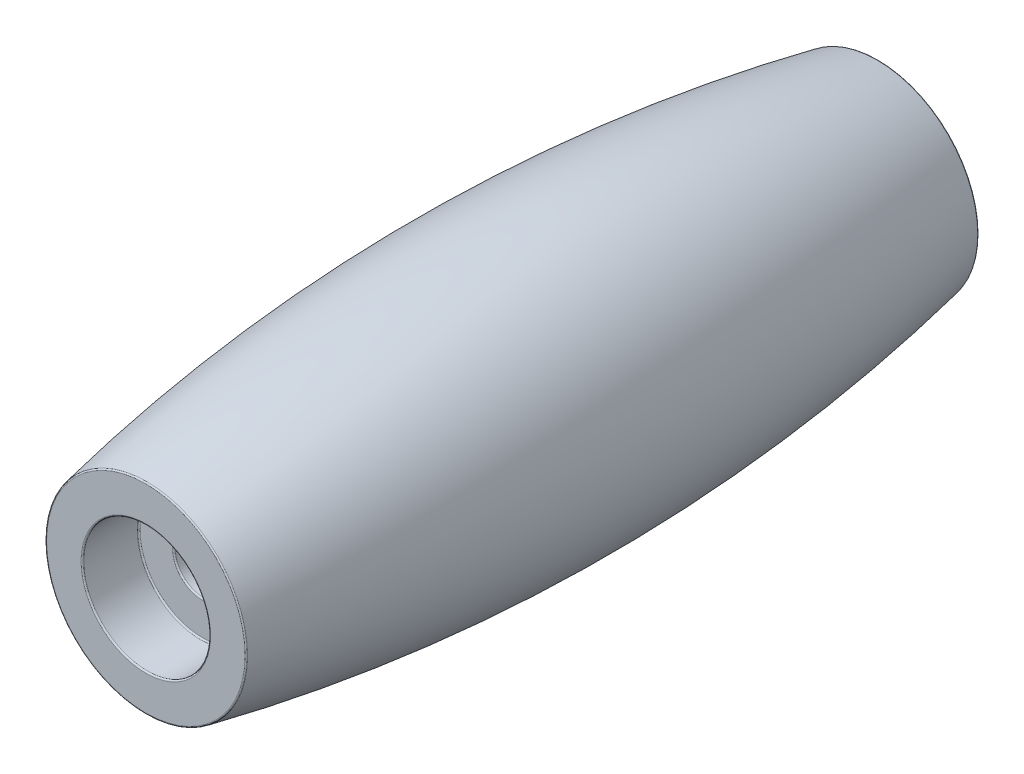
ISO-10303-21;
HEADER;
FILE_DESCRIPTION(('STEP AP214'),'2;1');
FILE_NAME('part.step','',(''),(''),'','','');
FILE_SCHEMA(('AUTOMOTIVE_DESIGN { 1 0 10303 214 1 1 1 1 }'));
ENDSEC;
DATA;
#1=APPLICATION_CONTEXT('core data for automotive mechanical design processes');
#2=APPLICATION_PROTOCOL_DEFINITION('international standard','automotive_design',2000,#1);
#3=PRODUCT_CONTEXT('',#1,'mechanical');
#4=PRODUCT('Part','Part','',(#3));
#5=PRODUCT_RELATED_PRODUCT_CATEGORY('part','',(#4));
#6=PRODUCT_DEFINITION_FORMATION('','',#4);
#7=PRODUCT_DEFINITION_CONTEXT('part definition',#1,'design');
#8=PRODUCT_DEFINITION('design','',#6,#7);
#9=PRODUCT_DEFINITION_SHAPE('','',#8);
#10=(LENGTH_UNIT() NAMED_UNIT(*) SI_UNIT(.MILLI.,.METRE.));
#11=(NAMED_UNIT(*) PLANE_ANGLE_UNIT() SI_UNIT($,.RADIAN.));
#12=(NAMED_UNIT(*) SI_UNIT($,.STERADIAN.) SOLID_ANGLE_UNIT());
#13=UNCERTAINTY_MEASURE_WITH_UNIT(LENGTH_MEASURE(1.E-05),#10,'distance_accuracy_value','');
#14=(GEOMETRIC_REPRESENTATION_CONTEXT(3) GLOBAL_UNCERTAINTY_ASSIGNED_CONTEXT((#13)) GLOBAL_UNIT_ASSIGNED_CONTEXT((#10,
#11,#12)) REPRESENTATION_CONTEXT('',''));
#15=CARTESIAN_POINT('',(0.,0.,0.));
#16=DIRECTION('',(0.,0.,1.));
#17=DIRECTION('',(1.,0.,0.));
#18=AXIS2_PLACEMENT_3D('',#15,#16,#17);
#19=CARTESIAN_POINT('',(2.00000000000001,0.,-22.));
#20=DIRECTION('',(0.,0.,1.));
#21=DIRECTION('',(1.,0.,0.));
#22=AXIS2_PLACEMENT_3D('',#19,#20,#21);
#23=PLANE('',#22);
#24=CARTESIAN_POINT('',(0.,0.,-22.));
#25=DIRECTION('',(0.,0.,1.));
#26=DIRECTION('',(1.,0.,0.));
#27=AXIS2_PLACEMENT_3D('',#24,#25,#26);
#28=CIRCLE('',#27,2.1);
#29=CARTESIAN_POINT('',(2.10000000000001,0.,-22.));
#30=VERTEX_POINT('',#29);
#31=EDGE_CURVE('E80',#30,#30,#28,.T.);
#32=ORIENTED_EDGE('',*,*,#31,.T.);
#33=EDGE_LOOP('',(#32));
#34=FACE_BOUND('',#33,.T.);
#35=CARTESIAN_POINT('',(0.,0.,-22.));
#36=DIRECTION('',(0.,0.,1.));
#37=DIRECTION('',(1.,0.,0.));
#38=AXIS2_PLACEMENT_3D('',#35,#36,#37);
#39=CIRCLE('',#38,4.4);
#40=CARTESIAN_POINT('',(4.40000000000001,0.,-22.));
#41=VERTEX_POINT('',#40);
#42=EDGE_CURVE('E83',#41,#41,#39,.F.);
#43=ORIENTED_EDGE('',*,*,#42,.T.);
#44=EDGE_LOOP('',(#43));
#45=FACE_BOUND('',#44,.T.);
#46=ADVANCED_FACE('F36',(#34,#45),#23,.F.);
#47=CARTESIAN_POINT('',(0.,0.,-26.));
#48=DIRECTION('',(0.,0.,-1.));
#49=DIRECTION('',(-1.,0.,0.));
#50=AXIS2_PLACEMENT_3D('',#47,#48,#49);
#51=CYLINDRICAL_SURFACE('',#50,4.5);
#52=CARTESIAN_POINT('',(0.,0.,-22.1));
#53=DIRECTION('',(0.,0.,1.));
#54=DIRECTION('',(1.,0.,0.));
#55=AXIS2_PLACEMENT_3D('',#52,#53,#54);
#56=CIRCLE('',#55,4.5);
#57=CARTESIAN_POINT('',(4.50000000000001,0.,-22.1));
#58=VERTEX_POINT('',#57);
#59=EDGE_CURVE('E74',#58,#58,#56,.T.);
#60=ORIENTED_EDGE('',*,*,#59,.T.);
#61=EDGE_LOOP('',(#60));
#62=FACE_BOUND('',#61,.T.);
#63=CARTESIAN_POINT('',(0.,0.,-25.9));
#64=DIRECTION('',(0.,0.,1.));
#65=DIRECTION('',(1.,0.,0.));
#66=AXIS2_PLACEMENT_3D('',#63,#64,#65);
#67=CIRCLE('',#66,4.5);
#68=CARTESIAN_POINT('',(4.50000000000001,0.,-25.9));
#69=VERTEX_POINT('',#68);
#70=EDGE_CURVE('E77',#69,#69,#67,.F.);
#71=ORIENTED_EDGE('',*,*,#70,.T.);
#72=EDGE_LOOP('',(#71));
#73=FACE_BOUND('',#72,.T.);
#74=ADVANCED_FACE('F129',(#62,#73),#51,.F.);
#75=CARTESIAN_POINT('',(4.50000000000001,0.,-26.));
#76=DIRECTION('',(0.,0.,1.));
#77=DIRECTION('',(1.,0.,0.));
#78=AXIS2_PLACEMENT_3D('',#75,#76,#77);
#79=PLANE('',#78);
#80=CARTESIAN_POINT('',(0.,0.,-26.));
#81=DIRECTION('',(0.,0.,1.));
#82=DIRECTION('',(1.,0.,0.));
#83=AXIS2_PLACEMENT_3D('',#80,#81,#82);
#84=CIRCLE('',#83,4.6);
#85=CARTESIAN_POINT('',(4.60000000000001,0.,-26.));
#86=VERTEX_POINT('',#85);
#87=EDGE_CURVE('E68',#86,#86,#84,.T.);
#88=ORIENTED_EDGE('',*,*,#87,.T.);
#89=EDGE_LOOP('',(#88));
#90=FACE_BOUND('',#89,.T.);
#91=CARTESIAN_POINT('',(0.,0.,-26.));
#92=DIRECTION('',(0.,0.,1.));
#93=DIRECTION('',(1.,0.,0.));
#94=AXIS2_PLACEMENT_3D('',#91,#92,#93);
#95=CIRCLE('',#94,7.04315579458446);
#96=CARTESIAN_POINT('',(7.04315579458446,0.,-26.));
#97=VERTEX_POINT('',#96);
#98=EDGE_CURVE('E71',#97,#97,#95,.F.);
#99=ORIENTED_EDGE('',*,*,#98,.T.);
#100=EDGE_LOOP('',(#99));
#101=FACE_BOUND('',#100,.T.);
#102=ADVANCED_FACE('F135',(#90,#101),#79,.F.);
#103=CARTESIAN_POINT('',(0.,0.,0.));
#104=DIRECTION('',(0.,0.,-1.));
#105=DIRECTION('',(-1.,0.,0.));
#106=AXIS2_PLACEMENT_3D('',#103,#104,#105);
#107=DEGENERATE_TOROIDAL_SURFACE('',#106,121.575,131.3,.F.);
#108=CARTESIAN_POINT('',(0.,0.,-25.9197408536585));
#109=DIRECTION('',(0.,0.,1.));
#110=DIRECTION('',(1.,0.,0.));
#111=AXIS2_PLACEMENT_3D('',#108,#109,#110);
#112=CIRCLE('',#111,7.14118792552545);
#113=CARTESIAN_POINT('',(7.14118792552545,0.,-25.9197408536585));
#114=VERTEX_POINT('',#113);
#115=EDGE_CURVE('E62',#114,#114,#112,.T.);
#116=ORIENTED_EDGE('',*,*,#115,.T.);
#117=EDGE_LOOP('',(#116));
#118=FACE_BOUND('',#117,.T.);
#119=CARTESIAN_POINT('',(0.,0.,25.9197408536585));
#120=DIRECTION('',(0.,0.,-1.));
#121=DIRECTION('',(-1.,0.,0.));
#122=AXIS2_PLACEMENT_3D('',#119,#120,#121);
#123=CIRCLE('',#122,7.14118792552545);
#124=CARTESIAN_POINT('',(-7.14118792552545,0.,25.9197408536585));
#125=VERTEX_POINT('',#124);
#126=EDGE_CURVE('E65',#125,#125,#123,.T.);
#127=ORIENTED_EDGE('',*,*,#126,.T.);
#128=EDGE_LOOP('',(#127));
#129=FACE_BOUND('',#128,.T.);
#130=ADVANCED_FACE('F162',(#118,#129),#107,.F.);
#131=CARTESIAN_POINT('',(4.50000000000001,0.,26.));
#132=DIRECTION('',(0.,0.,-1.));
#133=DIRECTION('',(-1.,0.,0.));
#134=AXIS2_PLACEMENT_3D('',#131,#132,#133);
#135=PLANE('',#134);
#136=CARTESIAN_POINT('',(0.,0.,26.));
#137=DIRECTION('',(0.,0.,-1.));
#138=DIRECTION('',(-1.,0.,0.));
#139=AXIS2_PLACEMENT_3D('',#136,#137,#138);
#140=CIRCLE('',#139,4.6);
#141=CARTESIAN_POINT('',(-4.59999999999999,0.,26.));
#142=VERTEX_POINT('',#141);
#143=EDGE_CURVE('E10',#142,#142,#140,.T.);
#144=ORIENTED_EDGE('',*,*,#143,.T.);
#145=EDGE_LOOP('',(#144));
#146=FACE_BOUND('',#145,.T.);
#147=CARTESIAN_POINT('',(0.,0.,26.));
#148=DIRECTION('',(0.,0.,-1.));
#149=DIRECTION('',(-1.,0.,0.));
#150=AXIS2_PLACEMENT_3D('',#147,#148,#149);
#151=CIRCLE('',#150,7.04315579458446);
#152=CARTESIAN_POINT('',(-7.04315579458446,0.,26.));
#153=VERTEX_POINT('',#152);
#154=EDGE_CURVE('E43',#153,#153,#151,.F.);
#155=ORIENTED_EDGE('',*,*,#154,.T.);
#156=EDGE_LOOP('',(#155));
#157=FACE_BOUND('',#156,.T.);
#158=ADVANCED_FACE('F118',(#146,#157),#135,.F.);
#159=CARTESIAN_POINT('',(0.,0.,-26.));
#160=DIRECTION('',(0.,0.,-1.));
#161=DIRECTION('',(-1.,0.,0.));
#162=AXIS2_PLACEMENT_3D('',#159,#160,#161);
#163=CYLINDRICAL_SURFACE('',#162,4.5);
#164=CARTESIAN_POINT('',(0.,0.,22.1));
#165=DIRECTION('',(0.,0.,-1.));
#166=DIRECTION('',(-1.,0.,0.));
#167=AXIS2_PLACEMENT_3D('',#164,#165,#166);
#168=CIRCLE('',#167,4.5);
#169=CARTESIAN_POINT('',(-4.49999999999999,0.,22.1));
#170=VERTEX_POINT('',#169);
#171=EDGE_CURVE('E47',#170,#170,#168,.T.);
#172=ORIENTED_EDGE('',*,*,#171,.T.);
#173=EDGE_LOOP('',(#172));
#174=FACE_BOUND('',#173,.T.);
#175=CARTESIAN_POINT('',(0.,0.,25.9));
#176=DIRECTION('',(0.,0.,-1.));
#177=DIRECTION('',(-1.,0.,0.));
#178=AXIS2_PLACEMENT_3D('',#175,#176,#177);
#179=CIRCLE('',#178,4.5);
#180=CARTESIAN_POINT('',(-4.49999999999999,0.,25.9));
#181=VERTEX_POINT('',#180);
#182=EDGE_CURVE('E51',#181,#181,#179,.F.);
#183=ORIENTED_EDGE('',*,*,#182,.T.);
#184=EDGE_LOOP('',(#183));
#185=FACE_BOUND('',#184,.T.);
#186=ADVANCED_FACE('F106',(#174,#185),#163,.F.);
#187=CARTESIAN_POINT('',(2.00000000000001,0.,22.));
#188=DIRECTION('',(0.,0.,-1.));
#189=DIRECTION('',(-1.,0.,0.));
#190=AXIS2_PLACEMENT_3D('',#187,#188,#189);
#191=PLANE('',#190);
#192=CARTESIAN_POINT('',(0.,0.,22.));
#193=DIRECTION('',(0.,0.,-1.));
#194=DIRECTION('',(-1.,0.,0.));
#195=AXIS2_PLACEMENT_3D('',#192,#193,#194);
#196=CIRCLE('',#195,2.1);
#197=CARTESIAN_POINT('',(-2.09999999999999,0.,22.));
#198=VERTEX_POINT('',#197);
#199=EDGE_CURVE('E56',#198,#198,#196,.T.);
#200=ORIENTED_EDGE('',*,*,#199,.T.);
#201=EDGE_LOOP('',(#200));
#202=FACE_BOUND('',#201,.T.);
#203=CARTESIAN_POINT('',(0.,0.,22.));
#204=DIRECTION('',(0.,0.,-1.));
#205=DIRECTION('',(-1.,0.,0.));
#206=AXIS2_PLACEMENT_3D('',#203,#204,#205);
#207=CIRCLE('',#206,4.4);
#208=CARTESIAN_POINT('',(-4.39999999999999,0.,22.));
#209=VERTEX_POINT('',#208);
#210=EDGE_CURVE('E59',#209,#209,#207,.F.);
#211=ORIENTED_EDGE('',*,*,#210,.T.);
#212=EDGE_LOOP('',(#211));
#213=FACE_BOUND('',#212,.T.);
#214=ADVANCED_FACE('F103',(#202,#213),#191,.F.);
#215=CARTESIAN_POINT('',(0.,0.,-26.));
#216=DIRECTION('',(0.,0.,-1.));
#217=DIRECTION('',(-1.,0.,0.));
#218=AXIS2_PLACEMENT_3D('',#215,#216,#217);
#219=CYLINDRICAL_SURFACE('',#218,2.);
#220=CARTESIAN_POINT('',(0.,0.,-21.9));
#221=DIRECTION('',(0.,0.,1.));
#222=DIRECTION('',(1.,0.,0.));
#223=AXIS2_PLACEMENT_3D('',#220,#221,#222);
#224=CIRCLE('',#223,2.);
#225=CARTESIAN_POINT('',(2.00000000000001,0.,-21.9));
#226=VERTEX_POINT('',#225);
#227=EDGE_CURVE('E86',#226,#226,#224,.F.);
#228=ORIENTED_EDGE('',*,*,#227,.T.);
#229=EDGE_LOOP('',(#228));
#230=FACE_BOUND('',#229,.T.);
#231=CARTESIAN_POINT('',(0.,0.,21.9));
#232=DIRECTION('',(0.,0.,-1.));
#233=DIRECTION('',(-1.,0.,0.));
#234=AXIS2_PLACEMENT_3D('',#231,#232,#233);
#235=CIRCLE('',#234,2.);
#236=CARTESIAN_POINT('',(-1.99999999999999,0.,21.9));
#237=VERTEX_POINT('',#236);
#238=EDGE_CURVE('E89',#237,#237,#235,.F.);
#239=ORIENTED_EDGE('',*,*,#238,.T.);
#240=EDGE_LOOP('',(#239));
#241=FACE_BOUND('',#240,.T.);
#242=ADVANCED_FACE('F93',(#230,#241),#219,.F.);
#243=CARTESIAN_POINT('',(0.,0.,-21.9));
#244=DIRECTION('',(0.,0.,1.));
#245=DIRECTION('',(1.,0.,0.));
#246=AXIS2_PLACEMENT_3D('',#243,#244,#245);
#247=TOROIDAL_SURFACE('',#246,2.1,0.1);
#248=ORIENTED_EDGE('',*,*,#31,.F.);
#249=EDGE_LOOP('',(#248));
#250=FACE_BOUND('',#249,.T.);
#251=ORIENTED_EDGE('',*,*,#227,.F.);
#252=EDGE_LOOP('',(#251));
#253=FACE_BOUND('',#252,.T.);
#254=ADVANCED_FACE('F141',(#250,#253),#247,.T.);
#255=CARTESIAN_POINT('',(0.,0.,-22.1));
#256=DIRECTION('',(0.,0.,1.));
#257=DIRECTION('',(1.,0.,0.));
#258=AXIS2_PLACEMENT_3D('',#255,#256,#257);
#259=TOROIDAL_SURFACE('',#258,4.4,0.1);
#260=ORIENTED_EDGE('',*,*,#59,.F.);
#261=EDGE_LOOP('',(#260));
#262=FACE_BOUND('',#261,.T.);
#263=ORIENTED_EDGE('',*,*,#42,.F.);
#264=EDGE_LOOP('',(#263));
#265=FACE_BOUND('',#264,.T.);
#266=ADVANCED_FACE('F144',(#262,#265),#259,.F.);
#267=CARTESIAN_POINT('',(0.,0.,-25.9));
#268=DIRECTION('',(0.,0.,1.));
#269=DIRECTION('',(1.,0.,0.));
#270=AXIS2_PLACEMENT_3D('',#267,#268,#269);
#271=TOROIDAL_SURFACE('',#270,4.6,0.1);
#272=ORIENTED_EDGE('',*,*,#87,.F.);
#273=EDGE_LOOP('',(#272));
#274=FACE_BOUND('',#273,.T.);
#275=ORIENTED_EDGE('',*,*,#70,.F.);
#276=EDGE_LOOP('',(#275));
#277=FACE_BOUND('',#276,.T.);
#278=ADVANCED_FACE('F148',(#274,#277),#271,.T.);
#279=CARTESIAN_POINT('',(0.,0.,-25.9));
#280=DIRECTION('',(0.,0.,1.));
#281=DIRECTION('',(1.,0.,0.));
#282=AXIS2_PLACEMENT_3D('',#279,#280,#281);
#283=TOROIDAL_SURFACE('',#282,7.04315579458446,0.1);
#284=ORIENTED_EDGE('',*,*,#115,.F.);
#285=EDGE_LOOP('',(#284));
#286=FACE_BOUND('',#285,.T.);
#287=ORIENTED_EDGE('',*,*,#98,.F.);
#288=EDGE_LOOP('',(#287));
#289=FACE_BOUND('',#288,.T.);
#290=ADVANCED_FACE('F99',(#286,#289),#283,.T.);
#291=CARTESIAN_POINT('',(0.,0.,21.9));
#292=DIRECTION('',(0.,0.,-1.));
#293=DIRECTION('',(-1.,0.,0.));
#294=AXIS2_PLACEMENT_3D('',#291,#292,#293);
#295=TOROIDAL_SURFACE('',#294,2.1,0.1);
#296=ORIENTED_EDGE('',*,*,#238,.F.);
#297=EDGE_LOOP('',(#296));
#298=FACE_BOUND('',#297,.T.);
#299=ORIENTED_EDGE('',*,*,#199,.F.);
#300=EDGE_LOOP('',(#299));
#301=FACE_BOUND('',#300,.T.);
#302=ADVANCED_FACE('F95',(#298,#301),#295,.T.);
#303=CARTESIAN_POINT('',(0.,0.,22.1));
#304=DIRECTION('',(0.,0.,-1.));
#305=DIRECTION('',(-1.,0.,0.));
#306=AXIS2_PLACEMENT_3D('',#303,#304,#305);
#307=TOROIDAL_SURFACE('',#306,4.4,0.1);
#308=ORIENTED_EDGE('',*,*,#210,.F.);
#309=EDGE_LOOP('',(#308));
#310=FACE_BOUND('',#309,.T.);
#311=ORIENTED_EDGE('',*,*,#171,.F.);
#312=EDGE_LOOP('',(#311));
#313=FACE_BOUND('',#312,.T.);
#314=ADVANCED_FACE('F98',(#310,#313),#307,.F.);
#315=CARTESIAN_POINT('',(0.,0.,25.9));
#316=DIRECTION('',(0.,0.,-1.));
#317=DIRECTION('',(-1.,0.,0.));
#318=AXIS2_PLACEMENT_3D('',#315,#316,#317);
#319=TOROIDAL_SURFACE('',#318,4.6,0.1);
#320=ORIENTED_EDGE('',*,*,#182,.F.);
#321=EDGE_LOOP('',(#320));
#322=FACE_BOUND('',#321,.T.);
#323=ORIENTED_EDGE('',*,*,#143,.F.);
#324=EDGE_LOOP('',(#323));
#325=FACE_BOUND('',#324,.T.);
#326=ADVANCED_FACE('F112',(#322,#325),#319,.T.);
#327=CARTESIAN_POINT('',(0.,0.,25.9));
#328=DIRECTION('',(0.,0.,-1.));
#329=DIRECTION('',(-1.,0.,0.));
#330=AXIS2_PLACEMENT_3D('',#327,#328,#329);
#331=TOROIDAL_SURFACE('',#330,7.04315579458446,0.1);
#332=ORIENTED_EDGE('',*,*,#154,.F.);
#333=EDGE_LOOP('',(#332));
#334=FACE_BOUND('',#333,.T.);
#335=ORIENTED_EDGE('',*,*,#126,.F.);
#336=EDGE_LOOP('',(#335));
#337=FACE_BOUND('',#336,.T.);
#338=ADVANCED_FACE('F38',(#334,#337),#331,.T.);
#339=CLOSED_SHELL('',(#46,#74,#102,#130,#158,#186,#214,#242,#254,#266,#278,#290,#302,#314,#326,#338));
#340=MANIFOLD_SOLID_BREP('B2',#339);
#341=ADVANCED_BREP_SHAPE_REPRESENTATION('',(#18,#340),#14);
#342=SHAPE_DEFINITION_REPRESENTATION(#9,#341);
ENDSEC;
END-ISO-10303-21;
